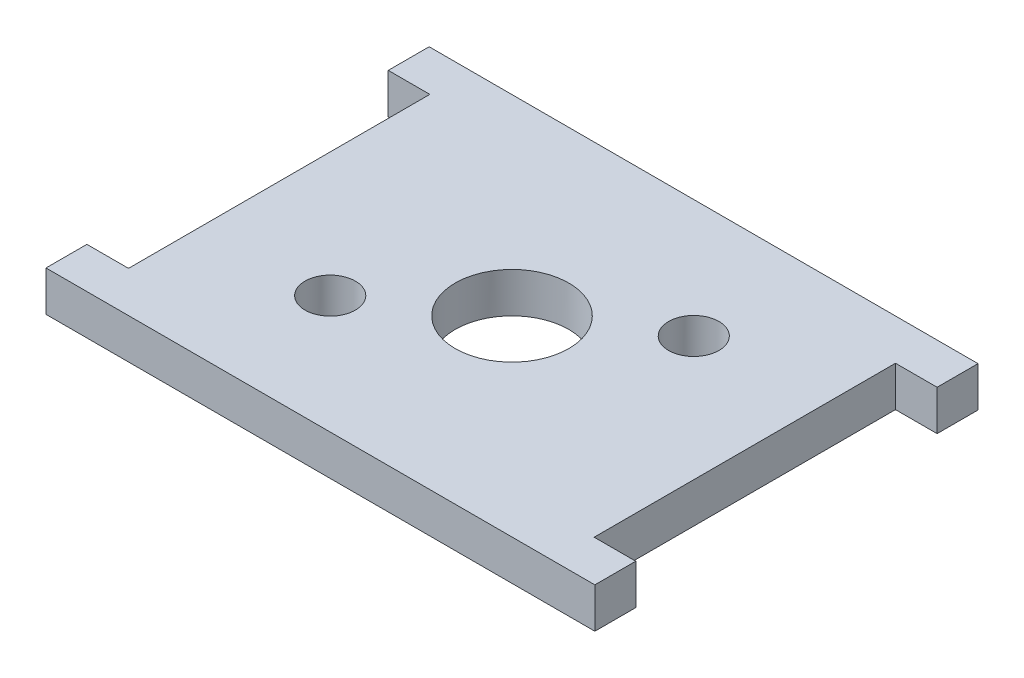
ISO-10303-21;
HEADER;
FILE_DESCRIPTION(('STEP AP214'),'2;1');
FILE_NAME('part.step','',(''),(''),'','','');
FILE_SCHEMA(('AUTOMOTIVE_DESIGN { 1 0 10303 214 1 1 1 1 }'));
ENDSEC;
DATA;
#1=APPLICATION_CONTEXT('core data for automotive mechanical design processes');
#2=APPLICATION_PROTOCOL_DEFINITION('international standard','automotive_design',2000,#1);
#3=PRODUCT_CONTEXT('',#1,'mechanical');
#4=PRODUCT('Part','Part','',(#3));
#5=PRODUCT_RELATED_PRODUCT_CATEGORY('part','',(#4));
#6=PRODUCT_DEFINITION_FORMATION('','',#4);
#7=PRODUCT_DEFINITION_CONTEXT('part definition',#1,'design');
#8=PRODUCT_DEFINITION('design','',#6,#7);
#9=PRODUCT_DEFINITION_SHAPE('','',#8);
#10=(LENGTH_UNIT() NAMED_UNIT(*) SI_UNIT(.MILLI.,.METRE.));
#11=(NAMED_UNIT(*) PLANE_ANGLE_UNIT() SI_UNIT($,.RADIAN.));
#12=(NAMED_UNIT(*) SI_UNIT($,.STERADIAN.) SOLID_ANGLE_UNIT());
#13=UNCERTAINTY_MEASURE_WITH_UNIT(LENGTH_MEASURE(1.E-05),#10,'distance_accuracy_value','');
#14=(GEOMETRIC_REPRESENTATION_CONTEXT(3) GLOBAL_UNCERTAINTY_ASSIGNED_CONTEXT((#13)) GLOBAL_UNIT_ASSIGNED_CONTEXT((#10,
#11,#12)) REPRESENTATION_CONTEXT('',''));
#15=CARTESIAN_POINT('',(0.,0.,0.));
#16=DIRECTION('',(0.,0.,1.));
#17=DIRECTION('',(1.,0.,0.));
#18=AXIS2_PLACEMENT_3D('',#15,#16,#17);
#19=CARTESIAN_POINT('',(39.878,2.921,0.));
#20=DIRECTION('',(-1.,0.,0.));
#21=DIRECTION('',(0.,0.,1.));
#22=AXIS2_PLACEMENT_3D('',#19,#20,#21);
#23=PLANE('',#22);
#24=DIRECTION('',(0.,0.,-1.));
#25=VECTOR('',#24,1.);
#26=CARTESIAN_POINT('',(39.878,2.921,0.));
#27=LINE('',#26,#25);
#28=CARTESIAN_POINT('',(39.878,2.921,-24.8666));
#29=VERTEX_POINT('',#28);
#30=CARTESIAN_POINT('',(39.878,2.921,-27.8384));
#31=VERTEX_POINT('',#30);
#32=EDGE_CURVE('E188',#29,#31,#27,.T.);
#33=ORIENTED_EDGE('',*,*,#32,.F.);
#34=DIRECTION('',(0.,1.,0.));
#35=VECTOR('',#34,1.);
#36=CARTESIAN_POINT('',(39.878,-0.00100000000000013,-24.8666));
#37=LINE('',#36,#35);
#38=CARTESIAN_POINT('',(39.878,0.,-24.8666));
#39=VERTEX_POINT('',#38);
#40=EDGE_CURVE('E135',#39,#29,#37,.T.);
#41=ORIENTED_EDGE('',*,*,#40,.F.);
#42=DIRECTION('',(0.,0.,-1.));
#43=VECTOR('',#42,1.);
#44=CARTESIAN_POINT('',(39.878,0.,0.));
#45=LINE('',#44,#43);
#46=CARTESIAN_POINT('',(39.878,0.,-27.8384));
#47=VERTEX_POINT('',#46);
#48=EDGE_CURVE('E151',#39,#47,#45,.T.);
#49=ORIENTED_EDGE('',*,*,#48,.T.);
#50=DIRECTION('',(0.,-1.,0.));
#51=VECTOR('',#50,1.);
#52=CARTESIAN_POINT('',(39.878,2.921,-27.8384));
#53=LINE('',#52,#51);
#54=EDGE_CURVE('E162',#31,#47,#53,.T.);
#55=ORIENTED_EDGE('',*,*,#54,.F.);
#56=EDGE_LOOP('',(#33,#41,#49,#55));
#57=FACE_BOUND('',#56,.T.);
#58=ADVANCED_FACE('F36',(#57),#23,.F.);
#59=CARTESIAN_POINT('',(0.,2.921,0.));
#60=DIRECTION('',(1.,0.,0.));
#61=DIRECTION('',(0.,0.,-1.));
#62=AXIS2_PLACEMENT_3D('',#59,#60,#61);
#63=PLANE('',#62);
#64=DIRECTION('',(0.,0.,1.));
#65=VECTOR('',#64,1.);
#66=CARTESIAN_POINT('',(0.,0.,0.));
#67=LINE('',#66,#65);
#68=CARTESIAN_POINT('',(0.,0.,-27.8384));
#69=VERTEX_POINT('',#68);
#70=CARTESIAN_POINT('',(0.,0.,-24.8666));
#71=VERTEX_POINT('',#70);
#72=EDGE_CURVE('E177',#69,#71,#67,.T.);
#73=ORIENTED_EDGE('',*,*,#72,.T.);
#74=DIRECTION('',(0.,1.,0.));
#75=VECTOR('',#74,1.);
#76=CARTESIAN_POINT('',(0.,-0.00100000000000013,-24.8666));
#77=LINE('',#76,#75);
#78=CARTESIAN_POINT('',(0.,2.921,-24.8666));
#79=VERTEX_POINT('',#78);
#80=EDGE_CURVE('E196',#71,#79,#77,.T.);
#81=ORIENTED_EDGE('',*,*,#80,.T.);
#82=DIRECTION('',(0.,0.,1.));
#83=VECTOR('',#82,1.);
#84=CARTESIAN_POINT('',(0.,2.921,0.));
#85=LINE('',#84,#83);
#86=CARTESIAN_POINT('',(0.,2.921,-27.8384));
#87=VERTEX_POINT('',#86);
#88=EDGE_CURVE('E191',#87,#79,#85,.T.);
#89=ORIENTED_EDGE('',*,*,#88,.F.);
#90=DIRECTION('',(0.,-1.,0.));
#91=VECTOR('',#90,1.);
#92=CARTESIAN_POINT('',(0.,2.921,-27.8384));
#93=LINE('',#92,#91);
#94=EDGE_CURVE('E159',#87,#69,#93,.T.);
#95=ORIENTED_EDGE('',*,*,#94,.T.);
#96=EDGE_LOOP('',(#73,#81,#89,#95));
#97=FACE_BOUND('',#96,.T.);
#98=ADVANCED_FACE('F262',(#97),#63,.F.);
#99=CARTESIAN_POINT('',(0.,2.921,-2.9718));
#100=VERTEX_POINT('',#99);
#101=CARTESIAN_POINT('',(0.,2.921,0.));
#102=VERTEX_POINT('',#101);
#103=EDGE_CURVE('E153',#100,#102,#85,.T.);
#104=ORIENTED_EDGE('',*,*,#103,.F.);
#105=DIRECTION('',(0.,1.,0.));
#106=VECTOR('',#105,1.);
#107=CARTESIAN_POINT('',(0.,-0.00100000000000013,-2.9718));
#108=LINE('',#107,#106);
#109=CARTESIAN_POINT('',(0.,0.,-2.9718));
#110=VERTEX_POINT('',#109);
#111=EDGE_CURVE('E197',#110,#100,#108,.T.);
#112=ORIENTED_EDGE('',*,*,#111,.F.);
#113=CARTESIAN_POINT('',(0.,0.,0.));
#114=VERTEX_POINT('',#113);
#115=EDGE_CURVE('E182',#110,#114,#67,.T.);
#116=ORIENTED_EDGE('',*,*,#115,.T.);
#117=DIRECTION('',(0.,-1.,0.));
#118=VECTOR('',#117,1.);
#119=CARTESIAN_POINT('',(0.,2.921,0.));
#120=LINE('',#119,#118);
#121=EDGE_CURVE('E11',#102,#114,#120,.T.);
#122=ORIENTED_EDGE('',*,*,#121,.F.);
#123=EDGE_LOOP('',(#104,#112,#116,#122));
#124=FACE_BOUND('',#123,.T.);
#125=ADVANCED_FACE('F38',(#124),#63,.F.);
#126=CARTESIAN_POINT('',(0.,2.921,0.));
#127=DIRECTION('',(0.,0.,-1.));
#128=DIRECTION('',(-1.,0.,0.));
#129=AXIS2_PLACEMENT_3D('',#126,#127,#128);
#130=PLANE('',#129);
#131=DIRECTION('',(1.,0.,0.));
#132=VECTOR('',#131,1.);
#133=CARTESIAN_POINT('',(0.,0.,0.));
#134=LINE('',#133,#132);
#135=CARTESIAN_POINT('',(39.878,0.,0.));
#136=VERTEX_POINT('',#135);
#137=EDGE_CURVE('E155',#114,#136,#134,.T.);
#138=ORIENTED_EDGE('',*,*,#137,.T.);
#139=DIRECTION('',(0.,-1.,0.));
#140=VECTOR('',#139,1.);
#141=CARTESIAN_POINT('',(39.878,2.921,0.));
#142=LINE('',#141,#140);
#143=CARTESIAN_POINT('',(39.878,2.921,0.));
#144=VERTEX_POINT('',#143);
#145=EDGE_CURVE('E44',#144,#136,#142,.T.);
#146=ORIENTED_EDGE('',*,*,#145,.F.);
#147=DIRECTION('',(1.,0.,0.));
#148=VECTOR('',#147,1.);
#149=CARTESIAN_POINT('',(0.,2.921,0.));
#150=LINE('',#149,#148);
#151=EDGE_CURVE('E189',#102,#144,#150,.T.);
#152=ORIENTED_EDGE('',*,*,#151,.F.);
#153=ORIENTED_EDGE('',*,*,#121,.T.);
#154=EDGE_LOOP('',(#138,#146,#152,#153));
#155=FACE_BOUND('',#154,.T.);
#156=ADVANCED_FACE('F278',(#155),#130,.F.);
#157=CARTESIAN_POINT('',(39.878,0.,-2.9718));
#158=VERTEX_POINT('',#157);
#159=EDGE_CURVE('E142',#136,#158,#45,.T.);
#160=ORIENTED_EDGE('',*,*,#159,.T.);
#161=DIRECTION('',(0.,1.,0.));
#162=VECTOR('',#161,1.);
#163=CARTESIAN_POINT('',(39.878,-0.00100000000000013,-2.9718));
#164=LINE('',#163,#162);
#165=CARTESIAN_POINT('',(39.878,2.921,-2.9718));
#166=VERTEX_POINT('',#165);
#167=EDGE_CURVE('E124',#158,#166,#164,.T.);
#168=ORIENTED_EDGE('',*,*,#167,.T.);
#169=EDGE_CURVE('E186',#144,#166,#27,.T.);
#170=ORIENTED_EDGE('',*,*,#169,.F.);
#171=ORIENTED_EDGE('',*,*,#145,.T.);
#172=EDGE_LOOP('',(#160,#168,#170,#171));
#173=FACE_BOUND('',#172,.T.);
#174=ADVANCED_FACE('F148',(#173),#23,.F.);
#175=CARTESIAN_POINT('',(0.,2.921,-27.8384));
#176=DIRECTION('',(0.,0.,1.));
#177=DIRECTION('',(1.,0.,0.));
#178=AXIS2_PLACEMENT_3D('',#175,#176,#177);
#179=PLANE('',#178);
#180=DIRECTION('',(-1.,0.,0.));
#181=VECTOR('',#180,1.);
#182=CARTESIAN_POINT('',(0.,0.,-27.8384));
#183=LINE('',#182,#181);
#184=EDGE_CURVE('E150',#47,#69,#183,.T.);
#185=ORIENTED_EDGE('',*,*,#184,.T.);
#186=ORIENTED_EDGE('',*,*,#94,.F.);
#187=DIRECTION('',(-1.,0.,0.));
#188=VECTOR('',#187,1.);
#189=CARTESIAN_POINT('',(0.,2.921,-27.8384));
#190=LINE('',#189,#188);
#191=EDGE_CURVE('E163',#31,#87,#190,.T.);
#192=ORIENTED_EDGE('',*,*,#191,.F.);
#193=ORIENTED_EDGE('',*,*,#54,.T.);
#194=EDGE_LOOP('',(#185,#186,#192,#193));
#195=FACE_BOUND('',#194,.T.);
#196=ADVANCED_FACE('F169',(#195),#179,.F.);
#197=CARTESIAN_POINT('',(0.,2.921,0.));
#198=DIRECTION('',(0.,-1.,0.));
#199=DIRECTION('',(0.,0.,-1.));
#200=AXIS2_PLACEMENT_3D('',#197,#198,#199);
#201=PLANE('',#200);
#202=CARTESIAN_POINT('',(27.813,2.921,-19.2532));
#203=DIRECTION('',(0.,1.,0.));
#204=DIRECTION('',(0.,0.,1.));
#205=AXIS2_PLACEMENT_3D('',#202,#203,#204);
#206=CIRCLE('',#205,1.8288);
#207=CARTESIAN_POINT('',(27.813,2.921,-17.4244));
#208=VERTEX_POINT('',#207);
#209=EDGE_CURVE('E234',#208,#208,#206,.T.);
#210=ORIENTED_EDGE('',*,*,#209,.F.);
#211=EDGE_LOOP('',(#210));
#212=FACE_BOUND('',#211,.T.);
#213=CARTESIAN_POINT('',(12.065,2.921,-8.5852));
#214=DIRECTION('',(0.,1.,0.));
#215=DIRECTION('',(0.,0.,1.));
#216=AXIS2_PLACEMENT_3D('',#213,#214,#215);
#217=CIRCLE('',#216,1.8288);
#218=CARTESIAN_POINT('',(12.065,2.921,-6.7564));
#219=VERTEX_POINT('',#218);
#220=EDGE_CURVE('E228',#219,#219,#217,.T.);
#221=ORIENTED_EDGE('',*,*,#220,.F.);
#222=EDGE_LOOP('',(#221));
#223=FACE_BOUND('',#222,.T.);
#224=CARTESIAN_POINT('',(19.939,2.921,-13.9192));
#225=DIRECTION('',(0.,1.,0.));
#226=DIRECTION('',(0.,0.,1.));
#227=AXIS2_PLACEMENT_3D('',#224,#225,#226);
#228=CIRCLE('',#227,4.1275);
#229=CARTESIAN_POINT('',(19.939,2.921,-9.7917));
#230=VERTEX_POINT('',#229);
#231=EDGE_CURVE('E145',#230,#230,#228,.T.);
#232=ORIENTED_EDGE('',*,*,#231,.F.);
#233=EDGE_LOOP('',(#232));
#234=FACE_BOUND('',#233,.T.);
#235=DIRECTION('',(0.,0.,1.));
#236=VECTOR('',#235,1.);
#237=CARTESIAN_POINT('',(36.8554,2.921,-24.8666));
#238=LINE('',#237,#236);
#239=CARTESIAN_POINT('',(36.8554,2.921,-24.8666));
#240=VERTEX_POINT('',#239);
#241=CARTESIAN_POINT('',(36.8554,2.921,-2.9718));
#242=VERTEX_POINT('',#241);
#243=EDGE_CURVE('E219',#240,#242,#238,.T.);
#244=ORIENTED_EDGE('',*,*,#243,.F.);
#245=DIRECTION('',(-1.,0.,0.));
#246=VECTOR('',#245,1.);
#247=CARTESIAN_POINT('',(39.878,2.921,-24.8666));
#248=LINE('',#247,#246);
#249=EDGE_CURVE('E221',#29,#240,#248,.T.);
#250=ORIENTED_EDGE('',*,*,#249,.F.);
#251=ORIENTED_EDGE('',*,*,#32,.T.);
#252=ORIENTED_EDGE('',*,*,#191,.T.);
#253=ORIENTED_EDGE('',*,*,#88,.T.);
#254=DIRECTION('',(-1.,0.,0.));
#255=VECTOR('',#254,1.);
#256=CARTESIAN_POINT('',(0.,2.921,-24.8666));
#257=LINE('',#256,#255);
#258=CARTESIAN_POINT('',(3.0226,2.921,-24.8666));
#259=VERTEX_POINT('',#258);
#260=EDGE_CURVE('E199',#259,#79,#257,.T.);
#261=ORIENTED_EDGE('',*,*,#260,.F.);
#262=DIRECTION('',(0.,0.,-1.));
#263=VECTOR('',#262,1.);
#264=CARTESIAN_POINT('',(3.0226,2.921,-24.8666));
#265=LINE('',#264,#263);
#266=CARTESIAN_POINT('',(3.0226,2.921,-2.9718));
#267=VERTEX_POINT('',#266);
#268=EDGE_CURVE('E205',#267,#259,#265,.T.);
#269=ORIENTED_EDGE('',*,*,#268,.F.);
#270=DIRECTION('',(1.,0.,0.));
#271=VECTOR('',#270,1.);
#272=CARTESIAN_POINT('',(0.,2.921,-2.9718));
#273=LINE('',#272,#271);
#274=EDGE_CURVE('E208',#100,#267,#273,.T.);
#275=ORIENTED_EDGE('',*,*,#274,.F.);
#276=ORIENTED_EDGE('',*,*,#103,.T.);
#277=ORIENTED_EDGE('',*,*,#151,.T.);
#278=ORIENTED_EDGE('',*,*,#169,.T.);
#279=DIRECTION('',(1.,0.,0.));
#280=VECTOR('',#279,1.);
#281=CARTESIAN_POINT('',(39.878,2.921,-2.9718));
#282=LINE('',#281,#280);
#283=EDGE_CURVE('E130',#242,#166,#282,.T.);
#284=ORIENTED_EDGE('',*,*,#283,.F.);
#285=EDGE_LOOP('',(#244,#250,#251,#252,#253,#261,#269,#275,#276,#277,#278,#284));
#286=FACE_BOUND('',#285,.T.);
#287=ADVANCED_FACE('F245',(#212,#223,#234,#286),#201,.F.);
#288=CARTESIAN_POINT('',(0.,0.,0.));
#289=DIRECTION('',(0.,-1.,0.));
#290=DIRECTION('',(0.,0.,-1.));
#291=AXIS2_PLACEMENT_3D('',#288,#289,#290);
#292=PLANE('',#291);
#293=CARTESIAN_POINT('',(27.813,0.,-19.2532));
#294=DIRECTION('',(0.,-1.,0.));
#295=DIRECTION('',(0.,0.,-1.));
#296=AXIS2_PLACEMENT_3D('',#293,#294,#295);
#297=CIRCLE('',#296,1.8288);
#298=CARTESIAN_POINT('',(27.813,0.,-21.082));
#299=VERTEX_POINT('',#298);
#300=EDGE_CURVE('E237',#299,#299,#297,.F.);
#301=ORIENTED_EDGE('',*,*,#300,.T.);
#302=EDGE_LOOP('',(#301));
#303=FACE_BOUND('',#302,.T.);
#304=CARTESIAN_POINT('',(12.065,0.,-8.5852));
#305=DIRECTION('',(0.,-1.,0.));
#306=DIRECTION('',(0.,0.,-1.));
#307=AXIS2_PLACEMENT_3D('',#304,#305,#306);
#308=CIRCLE('',#307,1.8288);
#309=CARTESIAN_POINT('',(12.065,0.,-10.414));
#310=VERTEX_POINT('',#309);
#311=EDGE_CURVE('E231',#310,#310,#308,.F.);
#312=ORIENTED_EDGE('',*,*,#311,.T.);
#313=EDGE_LOOP('',(#312));
#314=FACE_BOUND('',#313,.T.);
#315=CARTESIAN_POINT('',(19.939,0.,-13.9192));
#316=DIRECTION('',(0.,-1.,0.));
#317=DIRECTION('',(0.,0.,-1.));
#318=AXIS2_PLACEMENT_3D('',#315,#316,#317);
#319=CIRCLE('',#318,4.1275);
#320=CARTESIAN_POINT('',(19.939,0.,-18.0467));
#321=VERTEX_POINT('',#320);
#322=EDGE_CURVE('E225',#321,#321,#319,.F.);
#323=ORIENTED_EDGE('',*,*,#322,.T.);
#324=EDGE_LOOP('',(#323));
#325=FACE_BOUND('',#324,.T.);
#326=DIRECTION('',(-1.,0.,0.));
#327=VECTOR('',#326,1.);
#328=CARTESIAN_POINT('',(39.878,0.,-24.8666));
#329=LINE('',#328,#327);
#330=CARTESIAN_POINT('',(36.8554,0.,-24.8666));
#331=VERTEX_POINT('',#330);
#332=EDGE_CURVE('E144',#39,#331,#329,.T.);
#333=ORIENTED_EDGE('',*,*,#332,.T.);
#334=DIRECTION('',(0.,0.,1.));
#335=VECTOR('',#334,1.);
#336=CARTESIAN_POINT('',(36.8554,0.,-24.8666));
#337=LINE('',#336,#335);
#338=CARTESIAN_POINT('',(36.8554,0.,-2.9718));
#339=VERTEX_POINT('',#338);
#340=EDGE_CURVE('E143',#331,#339,#337,.T.);
#341=ORIENTED_EDGE('',*,*,#340,.T.);
#342=DIRECTION('',(1.,0.,0.));
#343=VECTOR('',#342,1.);
#344=CARTESIAN_POINT('',(39.878,0.,-2.9718));
#345=LINE('',#344,#343);
#346=EDGE_CURVE('E127',#339,#158,#345,.T.);
#347=ORIENTED_EDGE('',*,*,#346,.T.);
#348=ORIENTED_EDGE('',*,*,#159,.F.);
#349=ORIENTED_EDGE('',*,*,#137,.F.);
#350=ORIENTED_EDGE('',*,*,#115,.F.);
#351=DIRECTION('',(1.,0.,0.));
#352=VECTOR('',#351,1.);
#353=CARTESIAN_POINT('',(0.,0.,-2.9718));
#354=LINE('',#353,#352);
#355=CARTESIAN_POINT('',(3.0226,0.,-2.9718));
#356=VERTEX_POINT('',#355);
#357=EDGE_CURVE('E183',#110,#356,#354,.T.);
#358=ORIENTED_EDGE('',*,*,#357,.T.);
#359=DIRECTION('',(0.,0.,-1.));
#360=VECTOR('',#359,1.);
#361=CARTESIAN_POINT('',(3.0226,0.,-24.8666));
#362=LINE('',#361,#360);
#363=CARTESIAN_POINT('',(3.0226,0.,-24.8666));
#364=VERTEX_POINT('',#363);
#365=EDGE_CURVE('E211',#356,#364,#362,.T.);
#366=ORIENTED_EDGE('',*,*,#365,.T.);
#367=DIRECTION('',(-1.,0.,0.));
#368=VECTOR('',#367,1.);
#369=CARTESIAN_POINT('',(0.,0.,-24.8666));
#370=LINE('',#369,#368);
#371=EDGE_CURVE('E179',#364,#71,#370,.T.);
#372=ORIENTED_EDGE('',*,*,#371,.T.);
#373=ORIENTED_EDGE('',*,*,#72,.F.);
#374=ORIENTED_EDGE('',*,*,#184,.F.);
#375=ORIENTED_EDGE('',*,*,#48,.F.);
#376=EDGE_LOOP('',(#333,#341,#347,#348,#349,#350,#358,#366,#372,#373,#374,#375));
#377=FACE_BOUND('',#376,.T.);
#378=ADVANCED_FACE('F140',(#303,#314,#325,#377),#292,.T.);
#379=CARTESIAN_POINT('',(0.,-0.00100000000000013,-24.8666));
#380=DIRECTION('',(0.,0.,-1.));
#381=DIRECTION('',(-1.,0.,0.));
#382=AXIS2_PLACEMENT_3D('',#379,#380,#381);
#383=PLANE('',#382);
#384=DIRECTION('',(0.,1.,0.));
#385=VECTOR('',#384,1.);
#386=CARTESIAN_POINT('',(3.0226,-0.00100000000000013,-24.8666));
#387=LINE('',#386,#385);
#388=EDGE_CURVE('E201',#364,#259,#387,.T.);
#389=ORIENTED_EDGE('',*,*,#388,.T.);
#390=ORIENTED_EDGE('',*,*,#260,.T.);
#391=ORIENTED_EDGE('',*,*,#80,.F.);
#392=ORIENTED_EDGE('',*,*,#371,.F.);
#393=EDGE_LOOP('',(#389,#390,#391,#392));
#394=FACE_BOUND('',#393,.T.);
#395=ADVANCED_FACE('F264',(#394),#383,.F.);
#396=CARTESIAN_POINT('',(3.0226,-0.00100000000000013,-24.8666));
#397=DIRECTION('',(1.,0.,0.));
#398=DIRECTION('',(0.,0.,-1.));
#399=AXIS2_PLACEMENT_3D('',#396,#397,#398);
#400=PLANE('',#399);
#401=DIRECTION('',(0.,1.,0.));
#402=VECTOR('',#401,1.);
#403=CARTESIAN_POINT('',(3.0226,-0.00100000000000013,-2.9718));
#404=LINE('',#403,#402);
#405=EDGE_CURVE('E59',#356,#267,#404,.T.);
#406=ORIENTED_EDGE('',*,*,#405,.T.);
#407=ORIENTED_EDGE('',*,*,#268,.T.);
#408=ORIENTED_EDGE('',*,*,#388,.F.);
#409=ORIENTED_EDGE('',*,*,#365,.F.);
#410=EDGE_LOOP('',(#406,#407,#408,#409));
#411=FACE_BOUND('',#410,.T.);
#412=ADVANCED_FACE('F270',(#411),#400,.F.);
#413=CARTESIAN_POINT('',(0.,-0.00100000000000013,-2.9718));
#414=DIRECTION('',(0.,0.,1.));
#415=DIRECTION('',(1.,0.,0.));
#416=AXIS2_PLACEMENT_3D('',#413,#414,#415);
#417=PLANE('',#416);
#418=ORIENTED_EDGE('',*,*,#111,.T.);
#419=ORIENTED_EDGE('',*,*,#274,.T.);
#420=ORIENTED_EDGE('',*,*,#405,.F.);
#421=ORIENTED_EDGE('',*,*,#357,.F.);
#422=EDGE_LOOP('',(#418,#419,#420,#421));
#423=FACE_BOUND('',#422,.T.);
#424=ADVANCED_FACE('F271',(#423),#417,.F.);
#425=CARTESIAN_POINT('',(39.878,-0.00100000000000013,-24.8666));
#426=DIRECTION('',(0.,0.,-1.));
#427=DIRECTION('',(-1.,0.,0.));
#428=AXIS2_PLACEMENT_3D('',#425,#426,#427);
#429=PLANE('',#428);
#430=ORIENTED_EDGE('',*,*,#40,.T.);
#431=ORIENTED_EDGE('',*,*,#249,.T.);
#432=DIRECTION('',(0.,1.,0.));
#433=VECTOR('',#432,1.);
#434=CARTESIAN_POINT('',(36.8554,-0.00100000000000013,-24.8666));
#435=LINE('',#434,#433);
#436=EDGE_CURVE('E214',#331,#240,#435,.T.);
#437=ORIENTED_EDGE('',*,*,#436,.F.);
#438=ORIENTED_EDGE('',*,*,#332,.F.);
#439=EDGE_LOOP('',(#430,#431,#437,#438));
#440=FACE_BOUND('',#439,.T.);
#441=ADVANCED_FACE('F258',(#440),#429,.F.);
#442=CARTESIAN_POINT('',(39.878,-0.00100000000000013,-2.9718));
#443=DIRECTION('',(0.,0.,1.));
#444=DIRECTION('',(1.,0.,0.));
#445=AXIS2_PLACEMENT_3D('',#442,#443,#444);
#446=PLANE('',#445);
#447=DIRECTION('',(0.,1.,0.));
#448=VECTOR('',#447,1.);
#449=CARTESIAN_POINT('',(36.8554,-0.00100000000000013,-2.9718));
#450=LINE('',#449,#448);
#451=EDGE_CURVE('E51',#339,#242,#450,.T.);
#452=ORIENTED_EDGE('',*,*,#451,.T.);
#453=ORIENTED_EDGE('',*,*,#283,.T.);
#454=ORIENTED_EDGE('',*,*,#167,.F.);
#455=ORIENTED_EDGE('',*,*,#346,.F.);
#456=EDGE_LOOP('',(#452,#453,#454,#455));
#457=FACE_BOUND('',#456,.T.);
#458=ADVANCED_FACE('F126',(#457),#446,.F.);
#459=CARTESIAN_POINT('',(36.8554,-0.00100000000000013,-24.8666));
#460=DIRECTION('',(-1.,0.,0.));
#461=DIRECTION('',(0.,0.,1.));
#462=AXIS2_PLACEMENT_3D('',#459,#460,#461);
#463=PLANE('',#462);
#464=ORIENTED_EDGE('',*,*,#436,.T.);
#465=ORIENTED_EDGE('',*,*,#243,.T.);
#466=ORIENTED_EDGE('',*,*,#451,.F.);
#467=ORIENTED_EDGE('',*,*,#340,.F.);
#468=EDGE_LOOP('',(#464,#465,#466,#467));
#469=FACE_BOUND('',#468,.T.);
#470=ADVANCED_FACE('F255',(#469),#463,.F.);
#471=CARTESIAN_POINT('',(19.939,-0.00100000000000013,-13.9192));
#472=DIRECTION('',(0.,1.,0.));
#473=DIRECTION('',(0.,0.,1.));
#474=AXIS2_PLACEMENT_3D('',#471,#472,#473);
#475=CYLINDRICAL_SURFACE('',#474,4.1275);
#476=ORIENTED_EDGE('',*,*,#322,.F.);
#477=EDGE_LOOP('',(#476));
#478=FACE_BOUND('',#477,.T.);
#479=ORIENTED_EDGE('',*,*,#231,.T.);
#480=EDGE_LOOP('',(#479));
#481=FACE_BOUND('',#480,.T.);
#482=ADVANCED_FACE('F305',(#478,#481),#475,.F.);
#483=CARTESIAN_POINT('',(12.065,-0.00100000000000013,-8.5852));
#484=DIRECTION('',(0.,1.,0.));
#485=DIRECTION('',(0.,0.,1.));
#486=AXIS2_PLACEMENT_3D('',#483,#484,#485);
#487=CYLINDRICAL_SURFACE('',#486,1.8288);
#488=ORIENTED_EDGE('',*,*,#311,.F.);
#489=EDGE_LOOP('',(#488));
#490=FACE_BOUND('',#489,.T.);
#491=ORIENTED_EDGE('',*,*,#220,.T.);
#492=EDGE_LOOP('',(#491));
#493=FACE_BOUND('',#492,.T.);
#494=ADVANCED_FACE('F310',(#490,#493),#487,.F.);
#495=CARTESIAN_POINT('',(27.813,-0.00100000000000013,-19.2532));
#496=DIRECTION('',(0.,1.,0.));
#497=DIRECTION('',(0.,0.,1.));
#498=AXIS2_PLACEMENT_3D('',#495,#496,#497);
#499=CYLINDRICAL_SURFACE('',#498,1.8288);
#500=ORIENTED_EDGE('',*,*,#300,.F.);
#501=EDGE_LOOP('',(#500));
#502=FACE_BOUND('',#501,.T.);
#503=ORIENTED_EDGE('',*,*,#209,.T.);
#504=EDGE_LOOP('',(#503));
#505=FACE_BOUND('',#504,.T.);
#506=ADVANCED_FACE('F243',(#502,#505),#499,.F.);
#507=CLOSED_SHELL('',(#58,#98,#125,#156,#174,#196,#287,#378,#395,#412,#424,#441,#458,#470,#482,
#494,#506));
#508=MANIFOLD_SOLID_BREP('B2',#507);
#509=ADVANCED_BREP_SHAPE_REPRESENTATION('',(#18,#508),#14);
#510=SHAPE_DEFINITION_REPRESENTATION(#9,#509);
ENDSEC;
END-ISO-10303-21;
